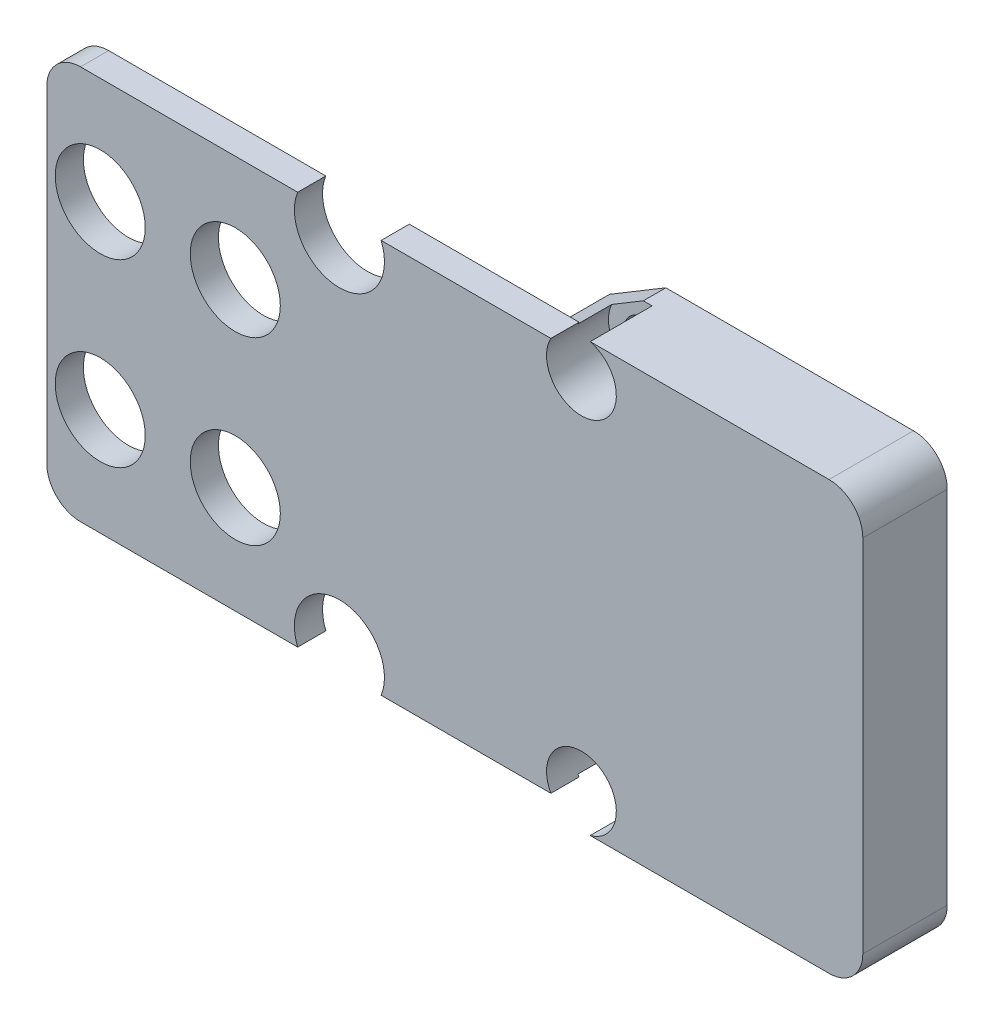
ISO-10303-21;
HEADER;
FILE_DESCRIPTION(('STEP AP214'),'2;1');
FILE_NAME('part.step','',(''),(''),'','','');
FILE_SCHEMA(('AUTOMOTIVE_DESIGN { 1 0 10303 214 1 1 1 1 }'));
ENDSEC;
DATA;
#1=APPLICATION_CONTEXT('core data for automotive mechanical design processes');
#2=APPLICATION_PROTOCOL_DEFINITION('international standard','automotive_design',2000,#1);
#3=PRODUCT_CONTEXT('',#1,'mechanical');
#4=PRODUCT('Part','Part','',(#3));
#5=PRODUCT_RELATED_PRODUCT_CATEGORY('part','',(#4));
#6=PRODUCT_DEFINITION_FORMATION('','',#4);
#7=PRODUCT_DEFINITION_CONTEXT('part definition',#1,'design');
#8=PRODUCT_DEFINITION('design','',#6,#7);
#9=PRODUCT_DEFINITION_SHAPE('','',#8);
#10=(LENGTH_UNIT() NAMED_UNIT(*) SI_UNIT(.MILLI.,.METRE.));
#11=(NAMED_UNIT(*) PLANE_ANGLE_UNIT() SI_UNIT($,.RADIAN.));
#12=(NAMED_UNIT(*) SI_UNIT($,.STERADIAN.) SOLID_ANGLE_UNIT());
#13=UNCERTAINTY_MEASURE_WITH_UNIT(LENGTH_MEASURE(1.E-05),#10,'distance_accuracy_value','');
#14=(GEOMETRIC_REPRESENTATION_CONTEXT(3) GLOBAL_UNCERTAINTY_ASSIGNED_CONTEXT((#13)) GLOBAL_UNIT_ASSIGNED_CONTEXT((#10,
#11,#12)) REPRESENTATION_CONTEXT('',''));
#15=CARTESIAN_POINT('',(0.,0.,0.));
#16=DIRECTION('',(0.,0.,1.));
#17=DIRECTION('',(1.,0.,0.));
#18=AXIS2_PLACEMENT_3D('',#15,#16,#17);
#19=CARTESIAN_POINT('',(-69.5864793964444,27.6995976152245,7.5));
#20=DIRECTION('',(0.,0.,-1.));
#21=DIRECTION('',(-1.,0.,0.));
#22=AXIS2_PLACEMENT_3D('',#19,#20,#21);
#23=CYLINDRICAL_SURFACE('',#22,1.70737013163461);
#24=CARTESIAN_POINT('',(-69.5864793964444,27.6995976152245,0.));
#25=DIRECTION('',(0.,0.,1.));
#26=DIRECTION('',(1.,0.,0.));
#27=AXIS2_PLACEMENT_3D('',#24,#25,#26);
#28=CIRCLE('',#27,1.70737013163461);
#29=CARTESIAN_POINT('',(-67.8791092648098,27.6995976152245,0.));
#30=VERTEX_POINT('',#29);
#31=EDGE_CURVE('E284',#30,#30,#28,.T.);
#32=ORIENTED_EDGE('',*,*,#31,.F.);
#33=EDGE_LOOP('',(#32));
#34=FACE_BOUND('',#33,.T.);
#35=CARTESIAN_POINT('',(-69.5864793964444,27.6995976152245,2.));
#36=DIRECTION('',(0.,0.,1.));
#37=DIRECTION('',(1.,0.,0.));
#38=AXIS2_PLACEMENT_3D('',#35,#36,#37);
#39=CIRCLE('',#38,1.70737013163461);
#40=CARTESIAN_POINT('',(-67.8791092648098,27.6995976152245,2.));
#41=VERTEX_POINT('',#40);
#42=EDGE_CURVE('E37',#41,#41,#39,.T.);
#43=ORIENTED_EDGE('',*,*,#42,.T.);
#44=EDGE_LOOP('',(#43));
#45=FACE_BOUND('',#44,.T.);
#46=ADVANCED_FACE('F33',(#34,#45),#23,.F.);
#47=CARTESIAN_POINT('',(-69.5864793964444,-4.30040238477549,7.5));
#48=DIRECTION('',(0.,0.,-1.));
#49=DIRECTION('',(-1.,0.,0.));
#50=AXIS2_PLACEMENT_3D('',#47,#48,#49);
#51=CYLINDRICAL_SURFACE('',#50,1.70737013163461);
#52=CARTESIAN_POINT('',(-69.5864793964444,-4.30040238477549,0.));
#53=DIRECTION('',(0.,0.,1.));
#54=DIRECTION('',(1.,0.,0.));
#55=AXIS2_PLACEMENT_3D('',#52,#53,#54);
#56=CIRCLE('',#55,1.70737013163461);
#57=CARTESIAN_POINT('',(-67.8791092648098,-4.30040238477549,0.));
#58=VERTEX_POINT('',#57);
#59=EDGE_CURVE('E274',#58,#58,#56,.T.);
#60=ORIENTED_EDGE('',*,*,#59,.F.);
#61=EDGE_LOOP('',(#60));
#62=FACE_BOUND('',#61,.T.);
#63=CARTESIAN_POINT('',(-69.5864793964444,-4.30040238477549,2.));
#64=DIRECTION('',(0.,0.,1.));
#65=DIRECTION('',(1.,0.,0.));
#66=AXIS2_PLACEMENT_3D('',#63,#64,#65);
#67=CIRCLE('',#66,1.70737013163461);
#68=CARTESIAN_POINT('',(-67.8791092648098,-4.30040238477549,2.));
#69=VERTEX_POINT('',#68);
#70=EDGE_CURVE('E208',#69,#69,#67,.T.);
#71=ORIENTED_EDGE('',*,*,#70,.T.);
#72=EDGE_LOOP('',(#71));
#73=FACE_BOUND('',#72,.T.);
#74=ADVANCED_FACE('F458',(#62,#73),#51,.F.);
#75=CARTESIAN_POINT('',(-117.086479396444,-5.80040238477549,5.));
#76=DIRECTION('',(0.,-1.,0.));
#77=DIRECTION('',(1.,0.,0.));
#78=AXIS2_PLACEMENT_3D('',#75,#76,#77);
#79=PLANE('',#78);
#80=DIRECTION('',(0.,0.,1.));
#81=VECTOR('',#80,1.);
#82=CARTESIAN_POINT('',(-72.2994113896945,-5.80040238477549,2.));
#83=LINE('',#82,#81);
#84=CARTESIAN_POINT('',(-72.2994113896945,-5.80040238477549,7.5));
#85=VERTEX_POINT('',#84);
#86=CARTESIAN_POINT('',(-72.2994113896945,-5.80040238477549,5.));
#87=VERTEX_POINT('',#86);
#88=EDGE_CURVE('E50',#85,#87,#83,.F.);
#89=ORIENTED_EDGE('',*,*,#88,.F.);
#90=DIRECTION('',(1.,0.,0.));
#91=VECTOR('',#90,1.);
#92=CARTESIAN_POINT('',(-117.086479396444,-5.80040238477549,7.5));
#93=LINE('',#92,#91);
#94=CARTESIAN_POINT('',(-87.3783801528965,-5.80040238477549,7.5));
#95=VERTEX_POINT('',#94);
#96=EDGE_CURVE('E280',#95,#85,#93,.T.);
#97=ORIENTED_EDGE('',*,*,#96,.F.);
#98=DIRECTION('',(0.,0.,1.));
#99=VECTOR('',#98,1.);
#100=CARTESIAN_POINT('',(-87.3783801528965,-5.80040238477549,5.));
#101=LINE('',#100,#99);
#102=CARTESIAN_POINT('',(-87.3783801528965,-5.80040238477549,5.));
#103=VERTEX_POINT('',#102);
#104=EDGE_CURVE('E248',#103,#95,#101,.T.);
#105=ORIENTED_EDGE('',*,*,#104,.F.);
#106=DIRECTION('',(1.,0.,0.));
#107=VECTOR('',#106,1.);
#108=CARTESIAN_POINT('',(-117.086479396444,-5.80040238477549,5.));
#109=LINE('',#108,#107);
#110=EDGE_CURVE('E266',#103,#87,#109,.T.);
#111=ORIENTED_EDGE('',*,*,#110,.T.);
#112=EDGE_LOOP('',(#89,#97,#105,#111));
#113=FACE_BOUND('',#112,.T.);
#114=ADVANCED_FACE('F404',(#113),#79,.T.);
#115=CARTESIAN_POINT('',(-72.0864793964444,29.1995976152245,5.));
#116=DIRECTION('',(0.,1.,0.));
#117=DIRECTION('',(-1.,0.,0.));
#118=AXIS2_PLACEMENT_3D('',#115,#116,#117);
#119=PLANE('',#118);
#120=DIRECTION('',(-1.,0.,0.));
#121=VECTOR('',#120,1.);
#122=CARTESIAN_POINT('',(-72.0864793964444,29.1995976152245,5.));
#123=LINE('',#122,#121);
#124=CARTESIAN_POINT('',(-94.7945786399922,29.1995976152245,5.));
#125=VERTEX_POINT('',#124);
#126=CARTESIAN_POINT('',(-114.086479396444,29.1995976152245,5.));
#127=VERTEX_POINT('',#126);
#128=EDGE_CURVE('E259',#125,#127,#123,.T.);
#129=ORIENTED_EDGE('',*,*,#128,.T.);
#130=DIRECTION('',(0.,0.,1.));
#131=VECTOR('',#130,1.);
#132=CARTESIAN_POINT('',(-114.086479396444,29.1995976152245,5.));
#133=LINE('',#132,#131);
#134=CARTESIAN_POINT('',(-114.086479396444,29.1995976152245,7.5));
#135=VERTEX_POINT('',#134);
#136=EDGE_CURVE('E325',#127,#135,#133,.T.);
#137=ORIENTED_EDGE('',*,*,#136,.T.);
#138=DIRECTION('',(-1.,0.,0.));
#139=VECTOR('',#138,1.);
#140=CARTESIAN_POINT('',(-72.0864793964444,29.1995976152245,7.5));
#141=LINE('',#140,#139);
#142=CARTESIAN_POINT('',(-94.7945786399922,29.1995976152245,7.5));
#143=VERTEX_POINT('',#142);
#144=EDGE_CURVE('E255',#143,#135,#141,.T.);
#145=ORIENTED_EDGE('',*,*,#144,.F.);
#146=DIRECTION('',(0.,0.,1.));
#147=VECTOR('',#146,1.);
#148=CARTESIAN_POINT('',(-94.7945786399922,29.1995976152245,5.));
#149=LINE('',#148,#147);
#150=EDGE_CURVE('E253',#125,#143,#149,.T.);
#151=ORIENTED_EDGE('',*,*,#150,.F.);
#152=EDGE_LOOP('',(#129,#137,#145,#151));
#153=FACE_BOUND('',#152,.T.);
#154=ADVANCED_FACE('F436',(#153),#119,.T.);
#155=CARTESIAN_POINT('',(-74.5864793964444,27.6995976152245,7.5));
#156=DIRECTION('',(1.,0.,0.));
#157=DIRECTION('',(0.,0.,-1.));
#158=AXIS2_PLACEMENT_3D('',#155,#156,#157);
#159=PLANE('',#158);
#160=DIRECTION('',(0.,1.,0.));
#161=VECTOR('',#160,1.);
#162=CARTESIAN_POINT('',(-74.5864793964444,-4.30040238477549,5.));
#163=LINE('',#162,#161);
#164=CARTESIAN_POINT('',(-74.5864793964444,-4.30040238477549,5.));
#165=VERTEX_POINT('',#164);
#166=CARTESIAN_POINT('',(-74.5864793964444,27.6995976152245,5.));
#167=VERTEX_POINT('',#166);
#168=EDGE_CURVE('E271',#165,#167,#163,.T.);
#169=ORIENTED_EDGE('',*,*,#168,.T.);
#170=DIRECTION('',(0.,0.,-1.));
#171=VECTOR('',#170,1.);
#172=CARTESIAN_POINT('',(-74.5864793964444,27.6995976152245,7.5));
#173=LINE('',#172,#171);
#174=CARTESIAN_POINT('',(-74.5864793964444,27.6995976152245,0.));
#175=VERTEX_POINT('',#174);
#176=EDGE_CURVE('E317',#167,#175,#173,.T.);
#177=ORIENTED_EDGE('',*,*,#176,.T.);
#178=DIRECTION('',(0.,-1.,0.));
#179=VECTOR('',#178,1.);
#180=CARTESIAN_POINT('',(-74.5864793964444,27.6995976152245,0.));
#181=LINE('',#180,#179);
#182=CARTESIAN_POINT('',(-74.5864793964444,-4.30040238477549,0.));
#183=VERTEX_POINT('',#182);
#184=EDGE_CURVE('E300',#175,#183,#181,.T.);
#185=ORIENTED_EDGE('',*,*,#184,.T.);
#186=DIRECTION('',(0.,0.,-1.));
#187=VECTOR('',#186,1.);
#188=CARTESIAN_POINT('',(-74.5864793964444,-4.30040238477549,7.5));
#189=LINE('',#188,#187);
#190=EDGE_CURVE('E315',#165,#183,#189,.T.);
#191=ORIENTED_EDGE('',*,*,#190,.F.);
#192=EDGE_LOOP('',(#169,#177,#185,#191));
#193=FACE_BOUND('',#192,.T.);
#194=ADVANCED_FACE('F396',(#193),#159,.F.);
#195=CARTESIAN_POINT('',(0.,0.,7.5));
#196=DIRECTION('',(0.,0.,-1.));
#197=DIRECTION('',(-1.,0.,0.));
#198=AXIS2_PLACEMENT_3D('',#195,#196,#197);
#199=PLANE('',#198);
#200=CARTESIAN_POINT('',(-100.336479396444,19.6995976152245,7.5));
#201=DIRECTION('',(0.,0.,1.));
#202=DIRECTION('',(1.,0.,0.));
#203=AXIS2_PLACEMENT_3D('',#200,#201,#202);
#204=CIRCLE('',#203,4.00000000000001);
#205=CARTESIAN_POINT('',(-96.3364793964443,19.6995976152245,7.5));
#206=VERTEX_POINT('',#205);
#207=EDGE_CURVE('E219',#206,#206,#204,.T.);
#208=ORIENTED_EDGE('',*,*,#207,.F.);
#209=EDGE_LOOP('',(#208));
#210=FACE_BOUND('',#209,.T.);
#211=CARTESIAN_POINT('',(-112.336479396444,19.6995976152245,7.5));
#212=DIRECTION('',(0.,0.,1.));
#213=DIRECTION('',(1.,0.,0.));
#214=AXIS2_PLACEMENT_3D('',#211,#212,#213);
#215=CIRCLE('',#214,4.00000000000001);
#216=CARTESIAN_POINT('',(-108.336479396444,19.6995976152245,7.5));
#217=VERTEX_POINT('',#216);
#218=EDGE_CURVE('E220',#217,#217,#215,.T.);
#219=ORIENTED_EDGE('',*,*,#218,.F.);
#220=EDGE_LOOP('',(#219));
#221=FACE_BOUND('',#220,.T.);
#222=CARTESIAN_POINT('',(-112.336479396444,3.69959761522452,7.5));
#223=DIRECTION('',(0.,0.,1.));
#224=DIRECTION('',(1.,0.,0.));
#225=AXIS2_PLACEMENT_3D('',#222,#223,#224);
#226=CIRCLE('',#225,4.00000000000001);
#227=CARTESIAN_POINT('',(-108.336479396444,3.69959761522452,7.5));
#228=VERTEX_POINT('',#227);
#229=EDGE_CURVE('E226',#228,#228,#226,.T.);
#230=ORIENTED_EDGE('',*,*,#229,.F.);
#231=EDGE_LOOP('',(#230));
#232=FACE_BOUND('',#231,.T.);
#233=CARTESIAN_POINT('',(-100.336479396444,3.69959761522452,7.5));
#234=DIRECTION('',(0.,0.,1.));
#235=DIRECTION('',(1.,0.,0.));
#236=AXIS2_PLACEMENT_3D('',#233,#234,#235);
#237=CIRCLE('',#236,4.00000000000001);
#238=CARTESIAN_POINT('',(-96.3364793964443,3.69959761522452,7.5));
#239=VERTEX_POINT('',#238);
#240=EDGE_CURVE('E215',#239,#239,#237,.T.);
#241=ORIENTED_EDGE('',*,*,#240,.F.);
#242=EDGE_LOOP('',(#241));
#243=FACE_BOUND('',#242,.T.);
#244=DIRECTION('',(-1.,0.,0.));
#245=VECTOR('',#244,1.);
#246=CARTESIAN_POINT('',(-69.5864793964444,30.6995976152245,7.5));
#247=LINE('',#246,#245);
#248=CARTESIAN_POINT('',(-47.5864793964444,30.6995976152245,7.5));
#249=VERTEX_POINT('',#248);
#250=CARTESIAN_POINT('',(-68.8054544288537,30.6995976152245,7.5));
#251=VERTEX_POINT('',#250);
#252=EDGE_CURVE('E294',#249,#251,#247,.T.);
#253=ORIENTED_EDGE('',*,*,#252,.T.);
#254=CARTESIAN_POINT('',(-69.5864793964444,27.6995976152245,7.5));
#255=DIRECTION('',(0.,0.,1.));
#256=DIRECTION('',(1.,0.,0.));
#257=AXIS2_PLACEMENT_3D('',#254,#255,#256);
#258=CIRCLE('',#257,3.1);
#259=CARTESIAN_POINT('',(-72.2994113896945,29.1995976152245,7.5));
#260=VERTEX_POINT('',#259);
#261=EDGE_CURVE('E198',#260,#251,#258,.T.);
#262=ORIENTED_EDGE('',*,*,#261,.F.);
#263=CARTESIAN_POINT('',(-87.3783801528965,29.1995976152245,7.5));
#264=VERTEX_POINT('',#263);
#265=EDGE_CURVE('E275',#260,#264,#141,.T.);
#266=ORIENTED_EDGE('',*,*,#265,.T.);
#267=CARTESIAN_POINT('',(-91.0864793964443,27.6995976152245,7.5));
#268=DIRECTION('',(0.,0.,1.));
#269=DIRECTION('',(1.,0.,0.));
#270=AXIS2_PLACEMENT_3D('',#267,#268,#269);
#271=CIRCLE('',#270,4.00000000000001);
#272=EDGE_CURVE('E237',#143,#264,#271,.T.);
#273=ORIENTED_EDGE('',*,*,#272,.F.);
#274=ORIENTED_EDGE('',*,*,#144,.T.);
#275=CARTESIAN_POINT('',(-114.086479396444,26.1995976152245,7.5));
#276=DIRECTION('',(0.,0.,-1.));
#277=DIRECTION('',(-1.,0.,0.));
#278=AXIS2_PLACEMENT_3D('',#275,#276,#277);
#279=CIRCLE('',#278,3.);
#280=CARTESIAN_POINT('',(-117.086479396444,26.1995976152245,7.5));
#281=VERTEX_POINT('',#280);
#282=EDGE_CURVE('E334',#135,#281,#279,.F.);
#283=ORIENTED_EDGE('',*,*,#282,.T.);
#284=DIRECTION('',(0.,-1.,0.));
#285=VECTOR('',#284,1.);
#286=CARTESIAN_POINT('',(-117.086479396444,29.1995976152245,7.5));
#287=LINE('',#286,#285);
#288=CARTESIAN_POINT('',(-117.086479396444,-2.8004023847755,7.5));
#289=VERTEX_POINT('',#288);
#290=EDGE_CURVE('E277',#281,#289,#287,.T.);
#291=ORIENTED_EDGE('',*,*,#290,.T.);
#292=CARTESIAN_POINT('',(-114.086479396444,-2.8004023847755,7.5));
#293=DIRECTION('',(0.,0.,-1.));
#294=DIRECTION('',(-1.,0.,0.));
#295=AXIS2_PLACEMENT_3D('',#292,#293,#294);
#296=CIRCLE('',#295,3.);
#297=CARTESIAN_POINT('',(-114.086479396444,-5.80040238477549,7.5));
#298=VERTEX_POINT('',#297);
#299=EDGE_CURVE('E332',#289,#298,#296,.F.);
#300=ORIENTED_EDGE('',*,*,#299,.T.);
#301=CARTESIAN_POINT('',(-94.7945786399922,-5.80040238477549,7.5));
#302=VERTEX_POINT('',#301);
#303=EDGE_CURVE('E260',#298,#302,#93,.T.);
#304=ORIENTED_EDGE('',*,*,#303,.T.);
#305=CARTESIAN_POINT('',(-91.0864793964443,-4.3004023847755,7.5));
#306=DIRECTION('',(0.,0.,1.));
#307=DIRECTION('',(1.,0.,0.));
#308=AXIS2_PLACEMENT_3D('',#305,#306,#307);
#309=CIRCLE('',#308,4.00000000000001);
#310=EDGE_CURVE('E242',#95,#302,#309,.T.);
#311=ORIENTED_EDGE('',*,*,#310,.F.);
#312=ORIENTED_EDGE('',*,*,#96,.T.);
#313=CARTESIAN_POINT('',(-69.5864793964444,-4.30040238477549,7.5));
#314=DIRECTION('',(0.,0.,1.));
#315=DIRECTION('',(1.,0.,0.));
#316=AXIS2_PLACEMENT_3D('',#313,#314,#315);
#317=CIRCLE('',#316,3.1);
#318=CARTESIAN_POINT('',(-68.8054544288537,-7.30040238477549,7.5));
#319=VERTEX_POINT('',#318);
#320=EDGE_CURVE('E199',#319,#85,#317,.T.);
#321=ORIENTED_EDGE('',*,*,#320,.F.);
#322=DIRECTION('',(1.,0.,0.));
#323=VECTOR('',#322,1.);
#324=CARTESIAN_POINT('',(-69.5864793964444,-7.30040238477549,7.5));
#325=LINE('',#324,#323);
#326=CARTESIAN_POINT('',(-47.5864793964444,-7.30040238477549,7.5));
#327=VERTEX_POINT('',#326);
#328=EDGE_CURVE('E288',#319,#327,#325,.T.);
#329=ORIENTED_EDGE('',*,*,#328,.T.);
#330=CARTESIAN_POINT('',(-47.5864793964444,-4.30040238477549,7.5));
#331=DIRECTION('',(0.,0.,-1.));
#332=DIRECTION('',(-1.,0.,0.));
#333=AXIS2_PLACEMENT_3D('',#330,#331,#332);
#334=CIRCLE('',#333,3.);
#335=CARTESIAN_POINT('',(-44.5864793964444,-4.30040238477549,7.5));
#336=VERTEX_POINT('',#335);
#337=EDGE_CURVE('E328',#327,#336,#334,.F.);
#338=ORIENTED_EDGE('',*,*,#337,.T.);
#339=DIRECTION('',(0.,1.,0.));
#340=VECTOR('',#339,1.);
#341=CARTESIAN_POINT('',(-44.5864793964444,30.6995976152245,7.5));
#342=LINE('',#341,#340);
#343=CARTESIAN_POINT('',(-44.5864793964444,27.6995976152245,7.5));
#344=VERTEX_POINT('',#343);
#345=EDGE_CURVE('E290',#336,#344,#342,.T.);
#346=ORIENTED_EDGE('',*,*,#345,.T.);
#347=CARTESIAN_POINT('',(-47.5864793964444,27.6995976152245,7.5));
#348=DIRECTION('',(0.,0.,-1.));
#349=DIRECTION('',(-1.,0.,0.));
#350=AXIS2_PLACEMENT_3D('',#347,#348,#349);
#351=CIRCLE('',#350,3.);
#352=EDGE_CURVE('E330',#344,#249,#351,.F.);
#353=ORIENTED_EDGE('',*,*,#352,.T.);
#354=EDGE_LOOP('',(#253,#262,#266,#273,#274,#283,#291,#300,#304,#311,#312,#321,#329,#338,#346,#353));
#355=FACE_BOUND('',#354,.T.);
#356=ADVANCED_FACE('F412',(#210,#221,#232,#243,#355),#199,.F.);
#357=CARTESIAN_POINT('',(0.,0.,0.));
#358=DIRECTION('',(0.,0.,-1.));
#359=DIRECTION('',(-1.,0.,0.));
#360=AXIS2_PLACEMENT_3D('',#357,#358,#359);
#361=PLANE('',#360);
#362=ORIENTED_EDGE('',*,*,#31,.T.);
#363=EDGE_LOOP('',(#362));
#364=FACE_BOUND('',#363,.T.);
#365=DIRECTION('',(-1.,0.,0.));
#366=VECTOR('',#365,1.);
#367=CARTESIAN_POINT('',(-69.5864793964444,30.6995976152245,0.));
#368=LINE('',#367,#366);
#369=CARTESIAN_POINT('',(-47.5864793964444,30.6995976152245,0.));
#370=VERTEX_POINT('',#369);
#371=CARTESIAN_POINT('',(-69.5864793964444,30.6995976152245,0.));
#372=VERTEX_POINT('',#371);
#373=EDGE_CURVE('E291',#370,#372,#368,.T.);
#374=ORIENTED_EDGE('',*,*,#373,.F.);
#375=CARTESIAN_POINT('',(-47.5864793964444,27.6995976152245,0.));
#376=DIRECTION('',(0.,0.,-1.));
#377=DIRECTION('',(-1.,0.,0.));
#378=AXIS2_PLACEMENT_3D('',#375,#376,#377);
#379=CIRCLE('',#378,3.);
#380=CARTESIAN_POINT('',(-44.5864793964444,27.6995976152245,0.));
#381=VERTEX_POINT('',#380);
#382=EDGE_CURVE('E352',#370,#381,#379,.T.);
#383=ORIENTED_EDGE('',*,*,#382,.T.);
#384=DIRECTION('',(0.,1.,0.));
#385=VECTOR('',#384,1.);
#386=CARTESIAN_POINT('',(-44.5864793964444,30.6995976152245,0.));
#387=LINE('',#386,#385);
#388=CARTESIAN_POINT('',(-44.5864793964444,-4.30040238477549,0.));
#389=VERTEX_POINT('',#388);
#390=EDGE_CURVE('E308',#389,#381,#387,.T.);
#391=ORIENTED_EDGE('',*,*,#390,.F.);
#392=CARTESIAN_POINT('',(-47.5864793964444,-4.30040238477549,0.));
#393=DIRECTION('',(0.,0.,-1.));
#394=DIRECTION('',(-1.,0.,0.));
#395=AXIS2_PLACEMENT_3D('',#392,#393,#394);
#396=CIRCLE('',#395,3.);
#397=CARTESIAN_POINT('',(-47.5864793964444,-7.30040238477549,0.));
#398=VERTEX_POINT('',#397);
#399=EDGE_CURVE('E350',#389,#398,#396,.T.);
#400=ORIENTED_EDGE('',*,*,#399,.T.);
#401=DIRECTION('',(1.,0.,0.));
#402=VECTOR('',#401,1.);
#403=CARTESIAN_POINT('',(-69.5864793964444,-7.30040238477549,0.));
#404=LINE('',#403,#402);
#405=CARTESIAN_POINT('',(-69.5864793964444,-7.30040238477549,0.));
#406=VERTEX_POINT('',#405);
#407=EDGE_CURVE('E305',#406,#398,#404,.T.);
#408=ORIENTED_EDGE('',*,*,#407,.F.);
#409=DIRECTION('',(0.857492925712544,-0.514495755427526,0.));
#410=VECTOR('',#409,1.);
#411=CARTESIAN_POINT('',(-74.5864793964444,-4.30040238477549,0.));
#412=LINE('',#411,#410);
#413=EDGE_CURVE('E303',#183,#406,#412,.T.);
#414=ORIENTED_EDGE('',*,*,#413,.F.);
#415=ORIENTED_EDGE('',*,*,#184,.F.);
#416=DIRECTION('',(-0.857492925712544,-0.514495755427527,0.));
#417=VECTOR('',#416,1.);
#418=CARTESIAN_POINT('',(-74.5864793964444,27.6995976152245,0.));
#419=LINE('',#418,#417);
#420=EDGE_CURVE('E287',#372,#175,#419,.T.);
#421=ORIENTED_EDGE('',*,*,#420,.F.);
#422=EDGE_LOOP('',(#374,#383,#391,#400,#408,#414,#415,#421));
#423=FACE_BOUND('',#422,.T.);
#424=ORIENTED_EDGE('',*,*,#59,.T.);
#425=EDGE_LOOP('',(#424));
#426=FACE_BOUND('',#425,.T.);
#427=ADVANCED_FACE('F472',(#364,#423,#426),#361,.T.);
#428=CARTESIAN_POINT('',(-74.5864793964444,27.6995976152245,7.5));
#429=DIRECTION('',(0.514495755427526,-0.857492925712544,0.));
#430=DIRECTION('',(0.857492925712544,0.514495755427527,0.));
#431=AXIS2_PLACEMENT_3D('',#428,#429,#430);
#432=PLANE('',#431);
#433=DIRECTION('',(0.857492925712544,0.514495755427527,0.));
#434=VECTOR('',#433,1.);
#435=CARTESIAN_POINT('',(-74.5864793964444,27.6995976152245,5.));
#436=LINE('',#435,#434);
#437=CARTESIAN_POINT('',(-72.3933359857296,29.0154836616534,5.));
#438=VERTEX_POINT('',#437);
#439=EDGE_CURVE('E256',#167,#438,#436,.T.);
#440=ORIENTED_EDGE('',*,*,#439,.T.);
#441=DIRECTION('',(0.,0.,1.));
#442=VECTOR('',#441,1.);
#443=CARTESIAN_POINT('',(-72.3933359857296,29.0154836616534,2.));
#444=LINE('',#443,#442);
#445=CARTESIAN_POINT('',(-72.3933359857296,29.0154836616534,2.));
#446=VERTEX_POINT('',#445);
#447=EDGE_CURVE('E58',#438,#446,#444,.F.);
#448=ORIENTED_EDGE('',*,*,#447,.T.);
#449=DIRECTION('',(-0.857492925712544,-0.514495755427527,0.));
#450=VECTOR('',#449,1.);
#451=CARTESIAN_POINT('',(-74.5864793964444,27.6995976152245,2.));
#452=LINE('',#451,#450);
#453=CARTESIAN_POINT('',(-69.5864793964444,30.6995976152245,2.));
#454=VERTEX_POINT('',#453);
#455=EDGE_CURVE('E213',#454,#446,#452,.T.);
#456=ORIENTED_EDGE('',*,*,#455,.F.);
#457=DIRECTION('',(0.,0.,-1.));
#458=VECTOR('',#457,1.);
#459=CARTESIAN_POINT('',(-69.5864793964444,30.6995976152245,7.5));
#460=LINE('',#459,#458);
#461=EDGE_CURVE('E297',#454,#372,#460,.T.);
#462=ORIENTED_EDGE('',*,*,#461,.T.);
#463=ORIENTED_EDGE('',*,*,#420,.T.);
#464=ORIENTED_EDGE('',*,*,#176,.F.);
#465=EDGE_LOOP('',(#440,#448,#456,#462,#463,#464));
#466=FACE_BOUND('',#465,.T.);
#467=ADVANCED_FACE('F388',(#466),#432,.F.);
#468=CARTESIAN_POINT('',(-74.5864793964444,-4.30040238477549,7.5));
#469=DIRECTION('',(0.514495755427526,0.857492925712544,0.));
#470=DIRECTION('',(-0.857492925712544,0.514495755427526,0.));
#471=AXIS2_PLACEMENT_3D('',#468,#469,#470);
#472=PLANE('',#471);
#473=DIRECTION('',(0.857492925712544,-0.514495755427526,0.));
#474=VECTOR('',#473,1.);
#475=CARTESIAN_POINT('',(-74.5864793964444,-4.30040238477549,2.));
#476=LINE('',#475,#474);
#477=CARTESIAN_POINT('',(-72.3933359857296,-5.61628843120437,2.));
#478=VERTEX_POINT('',#477);
#479=CARTESIAN_POINT('',(-69.5864793964444,-7.30040238477549,2.));
#480=VERTEX_POINT('',#479);
#481=EDGE_CURVE('E195',#478,#480,#476,.T.);
#482=ORIENTED_EDGE('',*,*,#481,.F.);
#483=DIRECTION('',(0.,0.,1.));
#484=VECTOR('',#483,1.);
#485=CARTESIAN_POINT('',(-72.3933359857296,-5.61628843120437,2.));
#486=LINE('',#485,#484);
#487=CARTESIAN_POINT('',(-72.3933359857296,-5.61628843120437,5.));
#488=VERTEX_POINT('',#487);
#489=EDGE_CURVE('E183',#478,#488,#486,.T.);
#490=ORIENTED_EDGE('',*,*,#489,.T.);
#491=DIRECTION('',(-0.857492925712544,0.514495755427526,0.));
#492=VECTOR('',#491,1.);
#493=CARTESIAN_POINT('',(-72.0864793964444,-5.80040238477549,5.));
#494=LINE('',#493,#492);
#495=EDGE_CURVE('E269',#488,#165,#494,.T.);
#496=ORIENTED_EDGE('',*,*,#495,.T.);
#497=ORIENTED_EDGE('',*,*,#190,.T.);
#498=ORIENTED_EDGE('',*,*,#413,.T.);
#499=DIRECTION('',(0.,0.,-1.));
#500=VECTOR('',#499,1.);
#501=CARTESIAN_POINT('',(-69.5864793964444,-7.30040238477549,7.5));
#502=LINE('',#501,#500);
#503=EDGE_CURVE('E204',#480,#406,#502,.T.);
#504=ORIENTED_EDGE('',*,*,#503,.F.);
#505=EDGE_LOOP('',(#482,#490,#496,#497,#498,#504));
#506=FACE_BOUND('',#505,.T.);
#507=ADVANCED_FACE('F202',(#506),#472,.F.);
#508=CARTESIAN_POINT('',(-69.5864793964444,-7.30040238477549,7.5));
#509=DIRECTION('',(0.,1.,0.));
#510=DIRECTION('',(0.,0.,1.));
#511=AXIS2_PLACEMENT_3D('',#508,#509,#510);
#512=PLANE('',#511);
#513=ORIENTED_EDGE('',*,*,#328,.F.);
#514=DIRECTION('',(0.,0.,1.));
#515=VECTOR('',#514,1.);
#516=CARTESIAN_POINT('',(-68.8054544288537,-7.30040238477549,2.));
#517=LINE('',#516,#515);
#518=CARTESIAN_POINT('',(-68.8054544288537,-7.30040238477549,2.));
#519=VERTEX_POINT('',#518);
#520=EDGE_CURVE('E374',#319,#519,#517,.F.);
#521=ORIENTED_EDGE('',*,*,#520,.T.);
#522=DIRECTION('',(1.,0.,0.));
#523=VECTOR('',#522,1.);
#524=CARTESIAN_POINT('',(-69.5864793964444,-7.30040238477549,2.));
#525=LINE('',#524,#523);
#526=EDGE_CURVE('E197',#480,#519,#525,.T.);
#527=ORIENTED_EDGE('',*,*,#526,.F.);
#528=ORIENTED_EDGE('',*,*,#503,.T.);
#529=ORIENTED_EDGE('',*,*,#407,.T.);
#530=DIRECTION('',(0.,0.,-1.));
#531=VECTOR('',#530,1.);
#532=CARTESIAN_POINT('',(-47.5864793964444,-7.30040238477549,7.5));
#533=LINE('',#532,#531);
#534=EDGE_CURVE('E359',#398,#327,#533,.F.);
#535=ORIENTED_EDGE('',*,*,#534,.T.);
#536=EDGE_LOOP('',(#513,#521,#527,#528,#529,#535));
#537=FACE_BOUND('',#536,.T.);
#538=ADVANCED_FACE('F482',(#537),#512,.F.);
#539=CARTESIAN_POINT('',(-44.5864793964444,30.6995976152245,7.5));
#540=DIRECTION('',(-1.,0.,0.));
#541=DIRECTION('',(0.,0.,1.));
#542=AXIS2_PLACEMENT_3D('',#539,#540,#541);
#543=PLANE('',#542);
#544=ORIENTED_EDGE('',*,*,#390,.T.);
#545=DIRECTION('',(0.,0.,-1.));
#546=VECTOR('',#545,1.);
#547=CARTESIAN_POINT('',(-44.5864793964444,27.6995976152245,7.5));
#548=LINE('',#547,#546);
#549=EDGE_CURVE('E357',#381,#344,#548,.F.);
#550=ORIENTED_EDGE('',*,*,#549,.T.);
#551=ORIENTED_EDGE('',*,*,#345,.F.);
#552=DIRECTION('',(0.,0.,-1.));
#553=VECTOR('',#552,1.);
#554=CARTESIAN_POINT('',(-44.5864793964444,-4.30040238477549,7.5));
#555=LINE('',#554,#553);
#556=EDGE_CURVE('E354',#336,#389,#555,.T.);
#557=ORIENTED_EDGE('',*,*,#556,.T.);
#558=EDGE_LOOP('',(#544,#550,#551,#557));
#559=FACE_BOUND('',#558,.T.);
#560=ADVANCED_FACE('F479',(#559),#543,.F.);
#561=CARTESIAN_POINT('',(-69.5864793964444,30.6995976152245,7.5));
#562=DIRECTION('',(0.,-1.,0.));
#563=DIRECTION('',(0.,0.,-1.));
#564=AXIS2_PLACEMENT_3D('',#561,#562,#563);
#565=PLANE('',#564);
#566=DIRECTION('',(-1.,0.,0.));
#567=VECTOR('',#566,1.);
#568=CARTESIAN_POINT('',(-69.5864793964444,30.6995976152245,2.));
#569=LINE('',#568,#567);
#570=CARTESIAN_POINT('',(-68.8054544288537,30.6995976152245,2.));
#571=VERTEX_POINT('',#570);
#572=EDGE_CURVE('E207',#571,#454,#569,.T.);
#573=ORIENTED_EDGE('',*,*,#572,.F.);
#574=DIRECTION('',(0.,0.,1.));
#575=VECTOR('',#574,1.);
#576=CARTESIAN_POINT('',(-68.8054544288537,30.6995976152245,2.));
#577=LINE('',#576,#575);
#578=EDGE_CURVE('E363',#571,#251,#577,.T.);
#579=ORIENTED_EDGE('',*,*,#578,.T.);
#580=ORIENTED_EDGE('',*,*,#252,.F.);
#581=DIRECTION('',(0.,0.,-1.));
#582=VECTOR('',#581,1.);
#583=CARTESIAN_POINT('',(-47.5864793964444,30.6995976152245,7.5));
#584=LINE('',#583,#582);
#585=EDGE_CURVE('E347',#249,#370,#584,.T.);
#586=ORIENTED_EDGE('',*,*,#585,.T.);
#587=ORIENTED_EDGE('',*,*,#373,.T.);
#588=ORIENTED_EDGE('',*,*,#461,.F.);
#589=EDGE_LOOP('',(#573,#579,#580,#586,#587,#588));
#590=FACE_BOUND('',#589,.T.);
#591=ADVANCED_FACE('F384',(#590),#565,.F.);
#592=ORIENTED_EDGE('',*,*,#303,.F.);
#593=DIRECTION('',(0.,0.,1.));
#594=VECTOR('',#593,1.);
#595=CARTESIAN_POINT('',(-114.086479396444,-5.80040238477549,5.));
#596=LINE('',#595,#594);
#597=CARTESIAN_POINT('',(-114.086479396444,-5.80040238477549,5.));
#598=VERTEX_POINT('',#597);
#599=EDGE_CURVE('E345',#298,#598,#596,.F.);
#600=ORIENTED_EDGE('',*,*,#599,.T.);
#601=CARTESIAN_POINT('',(-94.7945786399922,-5.80040238477549,5.));
#602=VERTEX_POINT('',#601);
#603=EDGE_CURVE('E267',#598,#602,#109,.T.);
#604=ORIENTED_EDGE('',*,*,#603,.T.);
#605=DIRECTION('',(0.,0.,1.));
#606=VECTOR('',#605,1.);
#607=CARTESIAN_POINT('',(-94.7945786399922,-5.80040238477549,5.));
#608=LINE('',#607,#606);
#609=EDGE_CURVE('E245',#302,#602,#608,.F.);
#610=ORIENTED_EDGE('',*,*,#609,.F.);
#611=EDGE_LOOP('',(#592,#600,#604,#610));
#612=FACE_BOUND('',#611,.T.);
#613=ADVANCED_FACE('F417',(#612),#79,.T.);
#614=CARTESIAN_POINT('',(-117.086479396444,29.1995976152245,5.));
#615=DIRECTION('',(-1.,0.,0.));
#616=DIRECTION('',(0.,-1.,0.));
#617=AXIS2_PLACEMENT_3D('',#614,#615,#616);
#618=PLANE('',#617);
#619=ORIENTED_EDGE('',*,*,#290,.F.);
#620=DIRECTION('',(0.,0.,1.));
#621=VECTOR('',#620,1.);
#622=CARTESIAN_POINT('',(-117.086479396444,26.1995976152245,5.));
#623=LINE('',#622,#621);
#624=CARTESIAN_POINT('',(-117.086479396444,26.1995976152245,5.));
#625=VERTEX_POINT('',#624);
#626=EDGE_CURVE('E339',#281,#625,#623,.F.);
#627=ORIENTED_EDGE('',*,*,#626,.T.);
#628=DIRECTION('',(0.,-1.,0.));
#629=VECTOR('',#628,1.);
#630=CARTESIAN_POINT('',(-117.086479396444,29.1995976152245,5.));
#631=LINE('',#630,#629);
#632=CARTESIAN_POINT('',(-117.086479396444,-2.8004023847755,5.));
#633=VERTEX_POINT('',#632);
#634=EDGE_CURVE('E263',#625,#633,#631,.T.);
#635=ORIENTED_EDGE('',*,*,#634,.T.);
#636=DIRECTION('',(0.,0.,1.));
#637=VECTOR('',#636,1.);
#638=CARTESIAN_POINT('',(-117.086479396444,-2.8004023847755,5.));
#639=LINE('',#638,#637);
#640=EDGE_CURVE('E336',#633,#289,#639,.T.);
#641=ORIENTED_EDGE('',*,*,#640,.T.);
#642=EDGE_LOOP('',(#619,#627,#635,#641));
#643=FACE_BOUND('',#642,.T.);
#644=ADVANCED_FACE('F427',(#643),#618,.T.);
#645=DIRECTION('',(0.,0.,1.));
#646=VECTOR('',#645,1.);
#647=CARTESIAN_POINT('',(-72.2994113896945,29.1995976152245,2.));
#648=LINE('',#647,#646);
#649=CARTESIAN_POINT('',(-72.2994113896945,29.1995976152245,5.));
#650=VERTEX_POINT('',#649);
#651=EDGE_CURVE('E370',#650,#260,#648,.T.);
#652=ORIENTED_EDGE('',*,*,#651,.F.);
#653=CARTESIAN_POINT('',(-87.3783801528965,29.1995976152245,5.));
#654=VERTEX_POINT('',#653);
#655=EDGE_CURVE('E261',#650,#654,#123,.T.);
#656=ORIENTED_EDGE('',*,*,#655,.T.);
#657=DIRECTION('',(0.,0.,1.));
#658=VECTOR('',#657,1.);
#659=CARTESIAN_POINT('',(-87.3783801528965,29.1995976152245,5.));
#660=LINE('',#659,#658);
#661=EDGE_CURVE('E250',#264,#654,#660,.F.);
#662=ORIENTED_EDGE('',*,*,#661,.F.);
#663=ORIENTED_EDGE('',*,*,#265,.F.);
#664=EDGE_LOOP('',(#652,#656,#662,#663));
#665=FACE_BOUND('',#664,.T.);
#666=ADVANCED_FACE('F447',(#665),#119,.T.);
#667=CARTESIAN_POINT('',(0.,0.,5.));
#668=DIRECTION('',(0.,0.,1.));
#669=DIRECTION('',(1.,0.,0.));
#670=AXIS2_PLACEMENT_3D('',#667,#668,#669);
#671=PLANE('',#670);
#672=CARTESIAN_POINT('',(-100.336479396444,19.6995976152245,5.));
#673=DIRECTION('',(0.,0.,1.));
#674=DIRECTION('',(1.,0.,0.));
#675=AXIS2_PLACEMENT_3D('',#672,#673,#674);
#676=CIRCLE('',#675,4.00000000000001);
#677=CARTESIAN_POINT('',(-96.3364793964443,19.6995976152245,5.));
#678=VERTEX_POINT('',#677);
#679=EDGE_CURVE('E234',#678,#678,#676,.T.);
#680=ORIENTED_EDGE('',*,*,#679,.T.);
#681=EDGE_LOOP('',(#680));
#682=FACE_BOUND('',#681,.T.);
#683=CARTESIAN_POINT('',(-112.336479396444,19.6995976152245,5.));
#684=DIRECTION('',(0.,0.,1.));
#685=DIRECTION('',(1.,0.,0.));
#686=AXIS2_PLACEMENT_3D('',#683,#684,#685);
#687=CIRCLE('',#686,4.00000000000001);
#688=CARTESIAN_POINT('',(-108.336479396444,19.6995976152245,5.));
#689=VERTEX_POINT('',#688);
#690=EDGE_CURVE('E216',#689,#689,#687,.T.);
#691=ORIENTED_EDGE('',*,*,#690,.T.);
#692=EDGE_LOOP('',(#691));
#693=FACE_BOUND('',#692,.T.);
#694=CARTESIAN_POINT('',(-112.336479396444,3.69959761522452,5.));
#695=DIRECTION('',(0.,0.,1.));
#696=DIRECTION('',(1.,0.,0.));
#697=AXIS2_PLACEMENT_3D('',#694,#695,#696);
#698=CIRCLE('',#697,4.00000000000001);
#699=CARTESIAN_POINT('',(-108.336479396444,3.69959761522452,5.));
#700=VERTEX_POINT('',#699);
#701=EDGE_CURVE('E223',#700,#700,#698,.T.);
#702=ORIENTED_EDGE('',*,*,#701,.T.);
#703=EDGE_LOOP('',(#702));
#704=FACE_BOUND('',#703,.T.);
#705=CARTESIAN_POINT('',(-100.336479396444,3.69959761522452,5.));
#706=DIRECTION('',(0.,0.,1.));
#707=DIRECTION('',(1.,0.,0.));
#708=AXIS2_PLACEMENT_3D('',#705,#706,#707);
#709=CIRCLE('',#708,4.00000000000001);
#710=CARTESIAN_POINT('',(-96.3364793964443,3.69959761522452,5.));
#711=VERTEX_POINT('',#710);
#712=EDGE_CURVE('E229',#711,#711,#709,.T.);
#713=ORIENTED_EDGE('',*,*,#712,.T.);
#714=EDGE_LOOP('',(#713));
#715=FACE_BOUND('',#714,.T.);
#716=ORIENTED_EDGE('',*,*,#655,.F.);
#717=CARTESIAN_POINT('',(-69.5864793964444,27.6995976152245,5.));
#718=DIRECTION('',(0.,0.,1.));
#719=DIRECTION('',(1.,0.,0.));
#720=AXIS2_PLACEMENT_3D('',#717,#718,#719);
#721=CIRCLE('',#720,3.1);
#722=EDGE_CURVE('E11',#650,#438,#721,.T.);
#723=ORIENTED_EDGE('',*,*,#722,.T.);
#724=ORIENTED_EDGE('',*,*,#439,.F.);
#725=ORIENTED_EDGE('',*,*,#168,.F.);
#726=ORIENTED_EDGE('',*,*,#495,.F.);
#727=CARTESIAN_POINT('',(-69.5864793964444,-4.30040238477549,5.));
#728=DIRECTION('',(0.,0.,1.));
#729=DIRECTION('',(1.,0.,0.));
#730=AXIS2_PLACEMENT_3D('',#727,#728,#729);
#731=CIRCLE('',#730,3.1);
#732=EDGE_CURVE('E42',#488,#87,#731,.T.);
#733=ORIENTED_EDGE('',*,*,#732,.T.);
#734=ORIENTED_EDGE('',*,*,#110,.F.);
#735=CARTESIAN_POINT('',(-91.0864793964443,-4.3004023847755,5.));
#736=DIRECTION('',(0.,0.,1.));
#737=DIRECTION('',(1.,0.,0.));
#738=AXIS2_PLACEMENT_3D('',#735,#736,#737);
#739=CIRCLE('',#738,4.00000000000001);
#740=EDGE_CURVE('E319',#103,#602,#739,.T.);
#741=ORIENTED_EDGE('',*,*,#740,.T.);
#742=ORIENTED_EDGE('',*,*,#603,.F.);
#743=CARTESIAN_POINT('',(-114.086479396444,-2.8004023847755,5.));
#744=DIRECTION('',(0.,0.,1.));
#745=DIRECTION('',(1.,0.,0.));
#746=AXIS2_PLACEMENT_3D('',#743,#744,#745);
#747=CIRCLE('',#746,3.);
#748=EDGE_CURVE('E341',#598,#633,#747,.F.);
#749=ORIENTED_EDGE('',*,*,#748,.T.);
#750=ORIENTED_EDGE('',*,*,#634,.F.);
#751=CARTESIAN_POINT('',(-114.086479396444,26.1995976152245,5.));
#752=DIRECTION('',(0.,0.,1.));
#753=DIRECTION('',(1.,0.,0.));
#754=AXIS2_PLACEMENT_3D('',#751,#752,#753);
#755=CIRCLE('',#754,3.);
#756=EDGE_CURVE('E343',#625,#127,#755,.F.);
#757=ORIENTED_EDGE('',*,*,#756,.T.);
#758=ORIENTED_EDGE('',*,*,#128,.F.);
#759=CARTESIAN_POINT('',(-91.0864793964443,27.6995976152245,5.));
#760=DIRECTION('',(0.,0.,1.));
#761=DIRECTION('',(1.,0.,0.));
#762=AXIS2_PLACEMENT_3D('',#759,#760,#761);
#763=CIRCLE('',#762,4.00000000000001);
#764=EDGE_CURVE('E322',#125,#654,#763,.T.);
#765=ORIENTED_EDGE('',*,*,#764,.T.);
#766=EDGE_LOOP('',(#716,#723,#724,#725,#726,#733,#734,#741,#742,#749,#750,#757,#758,#765));
#767=FACE_BOUND('',#766,.T.);
#768=ADVANCED_FACE('F393',(#682,#693,#704,#715,#767),#671,.F.);
#769=CARTESIAN_POINT('',(-91.0864793964443,-4.3004023847755,5.));
#770=DIRECTION('',(0.,0.,1.));
#771=DIRECTION('',(1.,0.,0.));
#772=AXIS2_PLACEMENT_3D('',#769,#770,#771);
#773=CYLINDRICAL_SURFACE('',#772,4.00000000000001);
#774=ORIENTED_EDGE('',*,*,#104,.T.);
#775=ORIENTED_EDGE('',*,*,#310,.T.);
#776=ORIENTED_EDGE('',*,*,#609,.T.);
#777=ORIENTED_EDGE('',*,*,#740,.F.);
#778=EDGE_LOOP('',(#774,#775,#776,#777));
#779=FACE_BOUND('',#778,.T.);
#780=ADVANCED_FACE('F409',(#779),#773,.F.);
#781=CARTESIAN_POINT('',(-100.336479396444,3.69959761522452,5.));
#782=DIRECTION('',(0.,0.,1.));
#783=DIRECTION('',(1.,0.,0.));
#784=AXIS2_PLACEMENT_3D('',#781,#782,#783);
#785=CYLINDRICAL_SURFACE('',#784,4.00000000000001);
#786=ORIENTED_EDGE('',*,*,#712,.F.);
#787=EDGE_LOOP('',(#786));
#788=FACE_BOUND('',#787,.T.);
#789=ORIENTED_EDGE('',*,*,#240,.T.);
#790=EDGE_LOOP('',(#789));
#791=FACE_BOUND('',#790,.T.);
#792=ADVANCED_FACE('F532',(#788,#791),#785,.F.);
#793=CARTESIAN_POINT('',(-112.336479396444,3.69959761522452,5.));
#794=DIRECTION('',(0.,0.,1.));
#795=DIRECTION('',(1.,0.,0.));
#796=AXIS2_PLACEMENT_3D('',#793,#794,#795);
#797=CYLINDRICAL_SURFACE('',#796,4.00000000000001);
#798=ORIENTED_EDGE('',*,*,#701,.F.);
#799=EDGE_LOOP('',(#798));
#800=FACE_BOUND('',#799,.T.);
#801=ORIENTED_EDGE('',*,*,#229,.T.);
#802=EDGE_LOOP('',(#801));
#803=FACE_BOUND('',#802,.T.);
#804=ADVANCED_FACE('F528',(#800,#803),#797,.F.);
#805=CARTESIAN_POINT('',(-112.336479396444,19.6995976152245,5.));
#806=DIRECTION('',(0.,0.,1.));
#807=DIRECTION('',(1.,0.,0.));
#808=AXIS2_PLACEMENT_3D('',#805,#806,#807);
#809=CYLINDRICAL_SURFACE('',#808,4.00000000000001);
#810=ORIENTED_EDGE('',*,*,#690,.F.);
#811=EDGE_LOOP('',(#810));
#812=FACE_BOUND('',#811,.T.);
#813=ORIENTED_EDGE('',*,*,#218,.T.);
#814=EDGE_LOOP('',(#813));
#815=FACE_BOUND('',#814,.T.);
#816=ADVANCED_FACE('F525',(#812,#815),#809,.F.);
#817=CARTESIAN_POINT('',(-91.0864793964443,27.6995976152245,5.));
#818=DIRECTION('',(0.,0.,1.));
#819=DIRECTION('',(1.,0.,0.));
#820=AXIS2_PLACEMENT_3D('',#817,#818,#819);
#821=CYLINDRICAL_SURFACE('',#820,4.00000000000001);
#822=ORIENTED_EDGE('',*,*,#150,.T.);
#823=ORIENTED_EDGE('',*,*,#272,.T.);
#824=ORIENTED_EDGE('',*,*,#661,.T.);
#825=ORIENTED_EDGE('',*,*,#764,.F.);
#826=EDGE_LOOP('',(#822,#823,#824,#825));
#827=FACE_BOUND('',#826,.T.);
#828=ADVANCED_FACE('F441',(#827),#821,.F.);
#829=CARTESIAN_POINT('',(-100.336479396444,19.6995976152245,5.));
#830=DIRECTION('',(0.,0.,1.));
#831=DIRECTION('',(1.,0.,0.));
#832=AXIS2_PLACEMENT_3D('',#829,#830,#831);
#833=CYLINDRICAL_SURFACE('',#832,4.00000000000001);
#834=ORIENTED_EDGE('',*,*,#679,.F.);
#835=EDGE_LOOP('',(#834));
#836=FACE_BOUND('',#835,.T.);
#837=ORIENTED_EDGE('',*,*,#207,.T.);
#838=EDGE_LOOP('',(#837));
#839=FACE_BOUND('',#838,.T.);
#840=ADVANCED_FACE('F495',(#836,#839),#833,.F.);
#841=CARTESIAN_POINT('',(-114.086479396444,26.1995976152245,5.));
#842=DIRECTION('',(0.,0.,1.));
#843=DIRECTION('',(1.,0.,0.));
#844=AXIS2_PLACEMENT_3D('',#841,#842,#843);
#845=CYLINDRICAL_SURFACE('',#844,3.);
#846=ORIENTED_EDGE('',*,*,#756,.F.);
#847=ORIENTED_EDGE('',*,*,#626,.F.);
#848=ORIENTED_EDGE('',*,*,#282,.F.);
#849=ORIENTED_EDGE('',*,*,#136,.F.);
#850=EDGE_LOOP('',(#846,#847,#848,#849));
#851=FACE_BOUND('',#850,.T.);
#852=ADVANCED_FACE('F430',(#851),#845,.T.);
#853=CARTESIAN_POINT('',(-114.086479396444,-2.8004023847755,5.));
#854=DIRECTION('',(0.,0.,1.));
#855=DIRECTION('',(1.,0.,0.));
#856=AXIS2_PLACEMENT_3D('',#853,#854,#855);
#857=CYLINDRICAL_SURFACE('',#856,3.);
#858=ORIENTED_EDGE('',*,*,#748,.F.);
#859=ORIENTED_EDGE('',*,*,#599,.F.);
#860=ORIENTED_EDGE('',*,*,#299,.F.);
#861=ORIENTED_EDGE('',*,*,#640,.F.);
#862=EDGE_LOOP('',(#858,#859,#860,#861));
#863=FACE_BOUND('',#862,.T.);
#864=ADVANCED_FACE('F421',(#863),#857,.T.);
#865=CARTESIAN_POINT('',(-47.5864793964444,27.6995976152245,7.5));
#866=DIRECTION('',(0.,0.,-1.));
#867=DIRECTION('',(-1.,0.,0.));
#868=AXIS2_PLACEMENT_3D('',#865,#866,#867);
#869=CYLINDRICAL_SURFACE('',#868,3.);
#870=ORIENTED_EDGE('',*,*,#352,.F.);
#871=ORIENTED_EDGE('',*,*,#549,.F.);
#872=ORIENTED_EDGE('',*,*,#382,.F.);
#873=ORIENTED_EDGE('',*,*,#585,.F.);
#874=EDGE_LOOP('',(#870,#871,#872,#873));
#875=FACE_BOUND('',#874,.T.);
#876=ADVANCED_FACE('F497',(#875),#869,.T.);
#877=CARTESIAN_POINT('',(-47.5864793964444,-4.30040238477549,7.5));
#878=DIRECTION('',(0.,0.,-1.));
#879=DIRECTION('',(-1.,0.,0.));
#880=AXIS2_PLACEMENT_3D('',#877,#878,#879);
#881=CYLINDRICAL_SURFACE('',#880,3.);
#882=ORIENTED_EDGE('',*,*,#337,.F.);
#883=ORIENTED_EDGE('',*,*,#534,.F.);
#884=ORIENTED_EDGE('',*,*,#399,.F.);
#885=ORIENTED_EDGE('',*,*,#556,.F.);
#886=EDGE_LOOP('',(#882,#883,#884,#885));
#887=FACE_BOUND('',#886,.T.);
#888=ADVANCED_FACE('F35',(#887),#881,.T.);
#889=CARTESIAN_POINT('',(-69.5864793964444,-4.30040238477549,2.));
#890=DIRECTION('',(0.,0.,1.));
#891=DIRECTION('',(1.,0.,0.));
#892=AXIS2_PLACEMENT_3D('',#889,#890,#891);
#893=PLANE('',#892);
#894=ORIENTED_EDGE('',*,*,#70,.F.);
#895=EDGE_LOOP('',(#894));
#896=FACE_BOUND('',#895,.T.);
#897=ORIENTED_EDGE('',*,*,#481,.T.);
#898=ORIENTED_EDGE('',*,*,#526,.T.);
#899=CARTESIAN_POINT('',(-69.5864793964444,-4.30040238477549,2.));
#900=DIRECTION('',(0.,0.,1.));
#901=DIRECTION('',(1.,0.,0.));
#902=AXIS2_PLACEMENT_3D('',#899,#900,#901);
#903=CIRCLE('',#902,3.1);
#904=EDGE_CURVE('E186',#519,#478,#903,.T.);
#905=ORIENTED_EDGE('',*,*,#904,.T.);
#906=EDGE_LOOP('',(#897,#898,#905));
#907=FACE_BOUND('',#906,.T.);
#908=ADVANCED_FACE('F194',(#896,#907),#893,.T.);
#909=CARTESIAN_POINT('',(-69.5864793964444,-4.30040238477549,2.));
#910=DIRECTION('',(0.,0.,1.));
#911=DIRECTION('',(1.,0.,0.));
#912=AXIS2_PLACEMENT_3D('',#909,#910,#911);
#913=CYLINDRICAL_SURFACE('',#912,3.1);
#914=ORIENTED_EDGE('',*,*,#320,.T.);
#915=ORIENTED_EDGE('',*,*,#88,.T.);
#916=ORIENTED_EDGE('',*,*,#732,.F.);
#917=ORIENTED_EDGE('',*,*,#489,.F.);
#918=ORIENTED_EDGE('',*,*,#904,.F.);
#919=ORIENTED_EDGE('',*,*,#520,.F.);
#920=EDGE_LOOP('',(#914,#915,#916,#917,#918,#919));
#921=FACE_BOUND('',#920,.T.);
#922=ADVANCED_FACE('F185',(#921),#913,.F.);
#923=CARTESIAN_POINT('',(-69.5864793964444,27.6995976152245,2.));
#924=DIRECTION('',(0.,0.,1.));
#925=DIRECTION('',(1.,0.,0.));
#926=AXIS2_PLACEMENT_3D('',#923,#924,#925);
#927=PLANE('',#926);
#928=ORIENTED_EDGE('',*,*,#42,.F.);
#929=EDGE_LOOP('',(#928));
#930=FACE_BOUND('',#929,.T.);
#931=ORIENTED_EDGE('',*,*,#455,.T.);
#932=CARTESIAN_POINT('',(-69.5864793964444,27.6995976152245,2.));
#933=DIRECTION('',(0.,0.,1.));
#934=DIRECTION('',(1.,0.,0.));
#935=AXIS2_PLACEMENT_3D('',#932,#933,#934);
#936=CIRCLE('',#935,3.1);
#937=EDGE_CURVE('E191',#446,#571,#936,.T.);
#938=ORIENTED_EDGE('',*,*,#937,.T.);
#939=ORIENTED_EDGE('',*,*,#572,.T.);
#940=EDGE_LOOP('',(#931,#938,#939));
#941=FACE_BOUND('',#940,.T.);
#942=ADVANCED_FACE('F381',(#930,#941),#927,.T.);
#943=CARTESIAN_POINT('',(-69.5864793964444,27.6995976152245,2.));
#944=DIRECTION('',(0.,0.,1.));
#945=DIRECTION('',(1.,0.,0.));
#946=AXIS2_PLACEMENT_3D('',#943,#944,#945);
#947=CYLINDRICAL_SURFACE('',#946,3.1);
#948=ORIENTED_EDGE('',*,*,#937,.F.);
#949=ORIENTED_EDGE('',*,*,#447,.F.);
#950=ORIENTED_EDGE('',*,*,#722,.F.);
#951=ORIENTED_EDGE('',*,*,#651,.T.);
#952=ORIENTED_EDGE('',*,*,#261,.T.);
#953=ORIENTED_EDGE('',*,*,#578,.F.);
#954=EDGE_LOOP('',(#948,#949,#950,#951,#952,#953));
#955=FACE_BOUND('',#954,.T.);
#956=ADVANCED_FACE('F448',(#955),#947,.F.);
#957=CLOSED_SHELL('',(#46,#74,#114,#154,#194,#356,#427,#467,#507,#538,#560,#591,#613,#644,#666,
#768,#780,#792,#804,#816,#828,#840,#852,#864,#876,#888,#908,#922,#942,#956));
#958=MANIFOLD_SOLID_BREP('B2',#957);
#959=ADVANCED_BREP_SHAPE_REPRESENTATION('',(#18,#958),#14);
#960=SHAPE_DEFINITION_REPRESENTATION(#9,#959);
ENDSEC;
END-ISO-10303-21;
